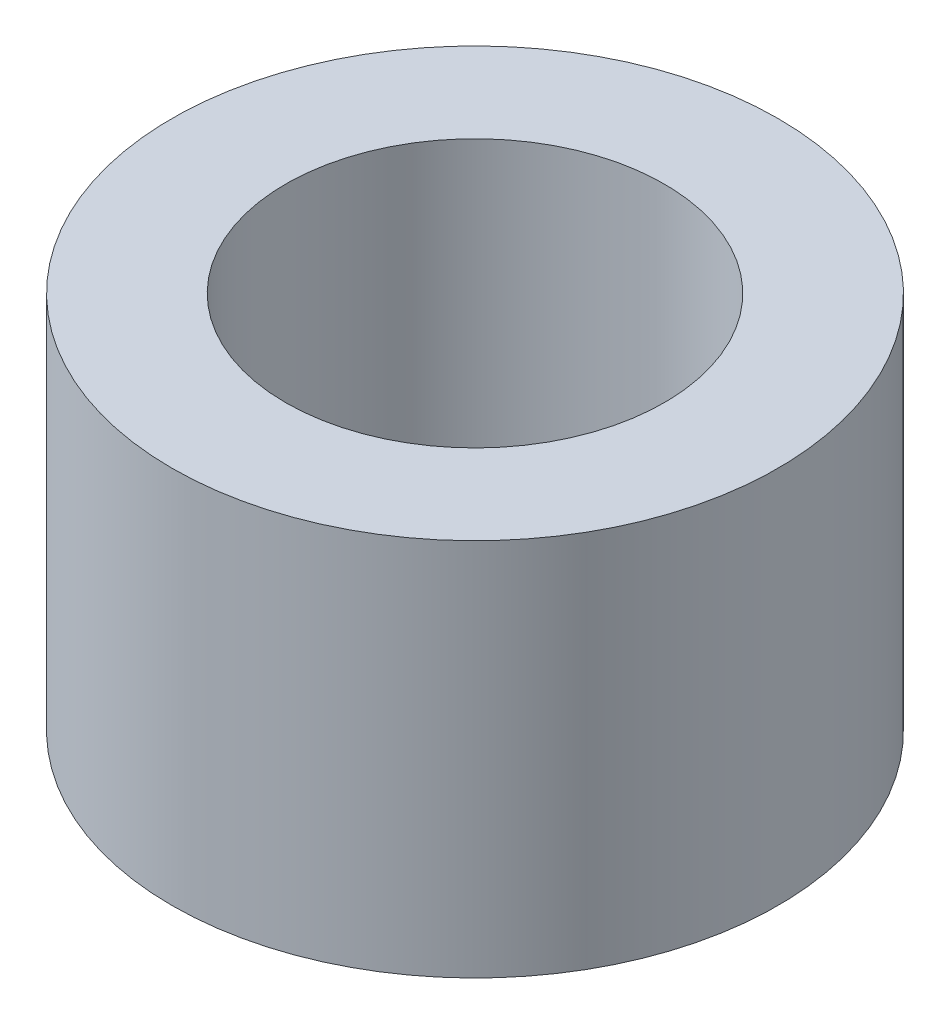
ISO-10303-21;
HEADER;
FILE_DESCRIPTION(('STEP AP214'),'2;1');
FILE_NAME('part.step','',(''),(''),'','','');
FILE_SCHEMA(('AUTOMOTIVE_DESIGN { 1 0 10303 214 1 1 1 1 }'));
ENDSEC;
DATA;
#1=APPLICATION_CONTEXT('core data for automotive mechanical design processes');
#2=APPLICATION_PROTOCOL_DEFINITION('international standard','automotive_design',2000,#1);
#3=PRODUCT_CONTEXT('',#1,'mechanical');
#4=PRODUCT('Part','Part','',(#3));
#5=PRODUCT_RELATED_PRODUCT_CATEGORY('part','',(#4));
#6=PRODUCT_DEFINITION_FORMATION('','',#4);
#7=PRODUCT_DEFINITION_CONTEXT('part definition',#1,'design');
#8=PRODUCT_DEFINITION('design','',#6,#7);
#9=PRODUCT_DEFINITION_SHAPE('','',#8);
#10=(LENGTH_UNIT() NAMED_UNIT(*) SI_UNIT(.MILLI.,.METRE.));
#11=(NAMED_UNIT(*) PLANE_ANGLE_UNIT() SI_UNIT($,.RADIAN.));
#12=(NAMED_UNIT(*) SI_UNIT($,.STERADIAN.) SOLID_ANGLE_UNIT());
#13=UNCERTAINTY_MEASURE_WITH_UNIT(LENGTH_MEASURE(1.E-05),#10,'distance_accuracy_value','');
#14=(GEOMETRIC_REPRESENTATION_CONTEXT(3) GLOBAL_UNCERTAINTY_ASSIGNED_CONTEXT((#13)) GLOBAL_UNIT_ASSIGNED_CONTEXT((#10,
#11,#12)) REPRESENTATION_CONTEXT('',''));
#15=CARTESIAN_POINT('',(0.,0.,0.));
#16=DIRECTION('',(0.,0.,1.));
#17=DIRECTION('',(1.,0.,0.));
#18=AXIS2_PLACEMENT_3D('',#15,#16,#17);
#19=CARTESIAN_POINT('',(0.,6.35,0.));
#20=DIRECTION('',(0.,1.,0.));
#21=DIRECTION('',(0.,0.,1.));
#22=AXIS2_PLACEMENT_3D('',#19,#20,#21);
#23=PLANE('',#22);
#24=CARTESIAN_POINT('',(0.,6.35,0.));
#25=DIRECTION('',(0.,1.,0.));
#26=DIRECTION('',(0.,0.,1.));
#27=AXIS2_PLACEMENT_3D('',#24,#25,#26);
#28=CIRCLE('',#27,5.08);
#29=CARTESIAN_POINT('',(0.,6.35,5.08));
#30=VERTEX_POINT('',#29);
#31=EDGE_CURVE('E10',#30,#30,#28,.T.);
#32=ORIENTED_EDGE('',*,*,#31,.T.);
#33=EDGE_LOOP('',(#32));
#34=FACE_BOUND('',#33,.T.);
#35=CARTESIAN_POINT('',(0.,6.35,0.));
#36=DIRECTION('',(0.,1.,0.));
#37=DIRECTION('',(0.,0.,1.));
#38=AXIS2_PLACEMENT_3D('',#35,#36,#37);
#39=CIRCLE('',#38,3.175);
#40=CARTESIAN_POINT('',(0.,6.35,3.175));
#41=VERTEX_POINT('',#40);
#42=EDGE_CURVE('E49',#41,#41,#39,.T.);
#43=ORIENTED_EDGE('',*,*,#42,.F.);
#44=EDGE_LOOP('',(#43));
#45=FACE_BOUND('',#44,.T.);
#46=ADVANCED_FACE('F39',(#34,#45),#23,.T.);
#47=CARTESIAN_POINT('',(0.,0.,0.));
#48=DIRECTION('',(0.,1.,0.));
#49=DIRECTION('',(0.,0.,1.));
#50=AXIS2_PLACEMENT_3D('',#47,#48,#49);
#51=PLANE('',#50);
#52=CARTESIAN_POINT('',(0.,0.,0.));
#53=DIRECTION('',(0.,1.,0.));
#54=DIRECTION('',(0.,0.,1.));
#55=AXIS2_PLACEMENT_3D('',#52,#53,#54);
#56=CIRCLE('',#55,5.08);
#57=CARTESIAN_POINT('',(0.,0.,5.08));
#58=VERTEX_POINT('',#57);
#59=EDGE_CURVE('E43',#58,#58,#56,.T.);
#60=ORIENTED_EDGE('',*,*,#59,.F.);
#61=EDGE_LOOP('',(#60));
#62=FACE_BOUND('',#61,.T.);
#63=CARTESIAN_POINT('',(0.,0.,0.));
#64=DIRECTION('',(0.,1.,0.));
#65=DIRECTION('',(0.,0.,1.));
#66=AXIS2_PLACEMENT_3D('',#63,#64,#65);
#67=CIRCLE('',#66,3.175);
#68=CARTESIAN_POINT('',(0.,0.,3.175));
#69=VERTEX_POINT('',#68);
#70=EDGE_CURVE('E55',#69,#69,#67,.T.);
#71=ORIENTED_EDGE('',*,*,#70,.T.);
#72=EDGE_LOOP('',(#71));
#73=FACE_BOUND('',#72,.T.);
#74=ADVANCED_FACE('F62',(#62,#73),#51,.F.);
#75=CARTESIAN_POINT('',(0.,6.35,0.));
#76=DIRECTION('',(0.,-1.,0.));
#77=DIRECTION('',(0.,0.,-1.));
#78=AXIS2_PLACEMENT_3D('',#75,#76,#77);
#79=CYLINDRICAL_SURFACE('',#78,5.08);
#80=ORIENTED_EDGE('',*,*,#31,.F.);
#81=EDGE_LOOP('',(#80));
#82=FACE_BOUND('',#81,.T.);
#83=ORIENTED_EDGE('',*,*,#59,.T.);
#84=EDGE_LOOP('',(#83));
#85=FACE_BOUND('',#84,.T.);
#86=ADVANCED_FACE('F41',(#82,#85),#79,.T.);
#87=CARTESIAN_POINT('',(0.,6.35,0.));
#88=DIRECTION('',(0.,-1.,0.));
#89=DIRECTION('',(0.,0.,-1.));
#90=AXIS2_PLACEMENT_3D('',#87,#88,#89);
#91=CYLINDRICAL_SURFACE('',#90,3.175);
#92=ORIENTED_EDGE('',*,*,#42,.T.);
#93=EDGE_LOOP('',(#92));
#94=FACE_BOUND('',#93,.T.);
#95=ORIENTED_EDGE('',*,*,#70,.F.);
#96=EDGE_LOOP('',(#95));
#97=FACE_BOUND('',#96,.T.);
#98=ADVANCED_FACE('F59',(#94,#97),#91,.F.);
#99=CLOSED_SHELL('',(#46,#74,#86,#98));
#100=MANIFOLD_SOLID_BREP('B2',#99);
#101=ADVANCED_BREP_SHAPE_REPRESENTATION('',(#18,#100),#14);
#102=SHAPE_DEFINITION_REPRESENTATION(#9,#101);
ENDSEC;
END-ISO-10303-21;
